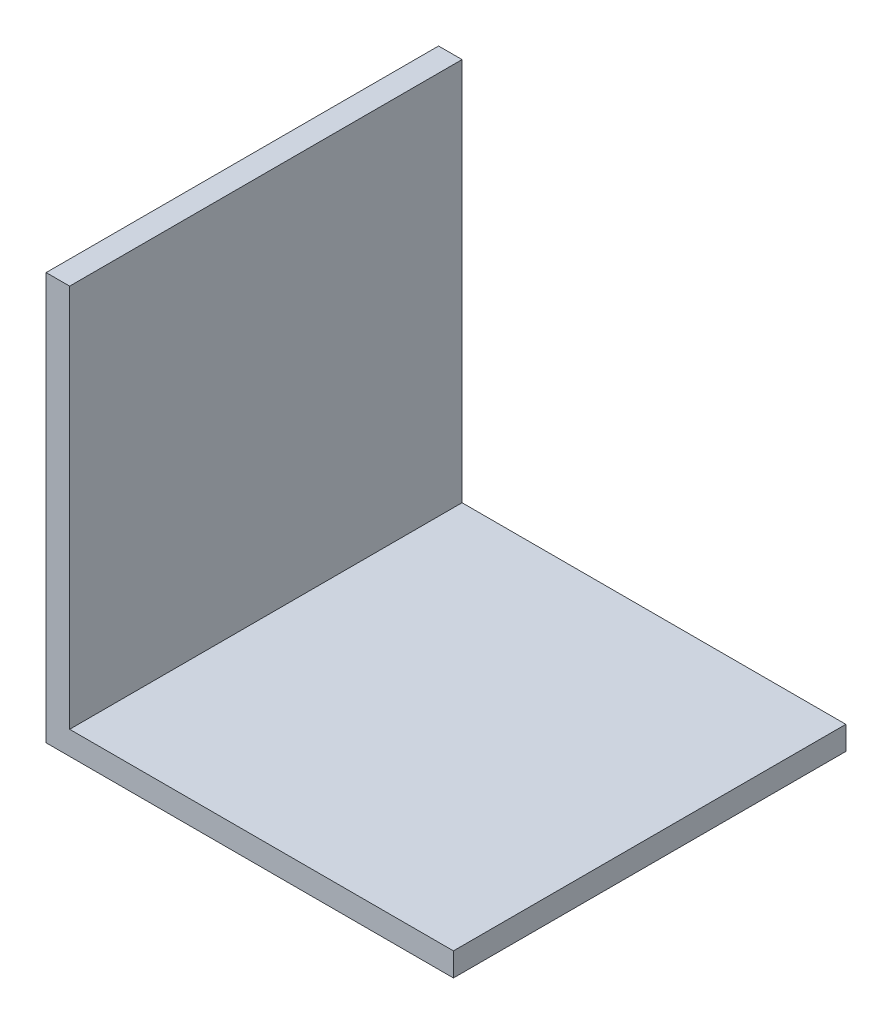
ISO-10303-21;
HEADER;
FILE_DESCRIPTION(('STEP AP214'),'2;1');
FILE_NAME('part.step','',(''),(''),'','','');
FILE_SCHEMA(('AUTOMOTIVE_DESIGN { 1 0 10303 214 1 1 1 1 }'));
ENDSEC;
DATA;
#1=APPLICATION_CONTEXT('core data for automotive mechanical design processes');
#2=APPLICATION_PROTOCOL_DEFINITION('international standard','automotive_design',2000,#1);
#3=PRODUCT_CONTEXT('',#1,'mechanical');
#4=PRODUCT('Part','Part','',(#3));
#5=PRODUCT_RELATED_PRODUCT_CATEGORY('part','',(#4));
#6=PRODUCT_DEFINITION_FORMATION('','',#4);
#7=PRODUCT_DEFINITION_CONTEXT('part definition',#1,'design');
#8=PRODUCT_DEFINITION('design','',#6,#7);
#9=PRODUCT_DEFINITION_SHAPE('','',#8);
#10=(LENGTH_UNIT() NAMED_UNIT(*) SI_UNIT(.MILLI.,.METRE.));
#11=(NAMED_UNIT(*) PLANE_ANGLE_UNIT() SI_UNIT($,.RADIAN.));
#12=(NAMED_UNIT(*) SI_UNIT($,.STERADIAN.) SOLID_ANGLE_UNIT());
#13=UNCERTAINTY_MEASURE_WITH_UNIT(LENGTH_MEASURE(1.E-05),#10,'distance_accuracy_value','');
#14=(GEOMETRIC_REPRESENTATION_CONTEXT(3) GLOBAL_UNCERTAINTY_ASSIGNED_CONTEXT((#13)) GLOBAL_UNIT_ASSIGNED_CONTEXT((#10,
#11,#12)) REPRESENTATION_CONTEXT('',''));
#15=CARTESIAN_POINT('',(0.,0.,0.));
#16=DIRECTION('',(0.,0.,1.));
#17=DIRECTION('',(1.,0.,0.));
#18=AXIS2_PLACEMENT_3D('',#15,#16,#17);
#19=CARTESIAN_POINT('',(0.,0.,25.05));
#20=DIRECTION('',(0.,1.,0.));
#21=DIRECTION('',(0.,0.,1.));
#22=AXIS2_PLACEMENT_3D('',#19,#20,#21);
#23=PLANE('',#22);
#24=DIRECTION('',(1.,0.,0.));
#25=VECTOR('',#24,1.);
#26=CARTESIAN_POINT('',(0.,0.,-25.05));
#27=LINE('',#26,#25);
#28=CARTESIAN_POINT('',(0.,0.,-25.05));
#29=VERTEX_POINT('',#28);
#30=CARTESIAN_POINT('',(52.,0.,-25.05));
#31=VERTEX_POINT('',#30);
#32=EDGE_CURVE('E125',#29,#31,#27,.T.);
#33=ORIENTED_EDGE('',*,*,#32,.T.);
#34=DIRECTION('',(0.,0.,-1.));
#35=VECTOR('',#34,1.);
#36=CARTESIAN_POINT('',(52.,0.,25.05));
#37=LINE('',#36,#35);
#38=CARTESIAN_POINT('',(52.,0.,25.05));
#39=VERTEX_POINT('',#38);
#40=EDGE_CURVE('E11',#39,#31,#37,.T.);
#41=ORIENTED_EDGE('',*,*,#40,.F.);
#42=DIRECTION('',(1.,0.,0.));
#43=VECTOR('',#42,1.);
#44=CARTESIAN_POINT('',(0.,0.,25.05));
#45=LINE('',#44,#43);
#46=CARTESIAN_POINT('',(0.,0.,25.05));
#47=VERTEX_POINT('',#46);
#48=EDGE_CURVE('E135',#47,#39,#45,.T.);
#49=ORIENTED_EDGE('',*,*,#48,.F.);
#50=DIRECTION('',(0.,0.,-1.));
#51=VECTOR('',#50,1.);
#52=CARTESIAN_POINT('',(0.,0.,25.05));
#53=LINE('',#52,#51);
#54=EDGE_CURVE('E121',#47,#29,#53,.T.);
#55=ORIENTED_EDGE('',*,*,#54,.T.);
#56=EDGE_LOOP('',(#33,#41,#49,#55));
#57=FACE_BOUND('',#56,.T.);
#58=ADVANCED_FACE('F41',(#57),#23,.F.);
#59=CARTESIAN_POINT('',(52.,3.,25.05));
#60=DIRECTION('',(-1.,0.,0.));
#61=DIRECTION('',(0.,0.,1.));
#62=AXIS2_PLACEMENT_3D('',#59,#60,#61);
#63=PLANE('',#62);
#64=DIRECTION('',(0.,1.,0.));
#65=VECTOR('',#64,1.);
#66=CARTESIAN_POINT('',(52.,3.,-25.05));
#67=LINE('',#66,#65);
#68=CARTESIAN_POINT('',(52.,3.,-25.05));
#69=VERTEX_POINT('',#68);
#70=EDGE_CURVE('E128',#31,#69,#67,.T.);
#71=ORIENTED_EDGE('',*,*,#70,.T.);
#72=DIRECTION('',(0.,0.,-1.));
#73=VECTOR('',#72,1.);
#74=CARTESIAN_POINT('',(52.,3.,25.05));
#75=LINE('',#74,#73);
#76=CARTESIAN_POINT('',(52.,3.,25.05));
#77=VERTEX_POINT('',#76);
#78=EDGE_CURVE('E49',#77,#69,#75,.T.);
#79=ORIENTED_EDGE('',*,*,#78,.F.);
#80=DIRECTION('',(0.,1.,0.));
#81=VECTOR('',#80,1.);
#82=CARTESIAN_POINT('',(52.,3.,25.05));
#83=LINE('',#82,#81);
#84=EDGE_CURVE('E94',#39,#77,#83,.T.);
#85=ORIENTED_EDGE('',*,*,#84,.F.);
#86=ORIENTED_EDGE('',*,*,#40,.T.);
#87=EDGE_LOOP('',(#71,#79,#85,#86));
#88=FACE_BOUND('',#87,.T.);
#89=ADVANCED_FACE('F159',(#88),#63,.F.);
#90=CARTESIAN_POINT('',(3.00000000000001,3.,25.05));
#91=DIRECTION('',(0.,-1.,0.));
#92=DIRECTION('',(0.,0.,-1.));
#93=AXIS2_PLACEMENT_3D('',#90,#91,#92);
#94=PLANE('',#93);
#95=DIRECTION('',(-1.,0.,0.));
#96=VECTOR('',#95,1.);
#97=CARTESIAN_POINT('',(3.00000000000001,3.,-25.05));
#98=LINE('',#97,#96);
#99=CARTESIAN_POINT('',(3.00000000000001,3.,-25.05));
#100=VERTEX_POINT('',#99);
#101=EDGE_CURVE('E130',#69,#100,#98,.T.);
#102=ORIENTED_EDGE('',*,*,#101,.T.);
#103=DIRECTION('',(0.,0.,-1.));
#104=VECTOR('',#103,1.);
#105=CARTESIAN_POINT('',(3.00000000000001,3.,25.05));
#106=LINE('',#105,#104);
#107=CARTESIAN_POINT('',(3.00000000000001,3.,25.05));
#108=VERTEX_POINT('',#107);
#109=EDGE_CURVE('E116',#108,#100,#106,.T.);
#110=ORIENTED_EDGE('',*,*,#109,.F.);
#111=DIRECTION('',(-1.,0.,0.));
#112=VECTOR('',#111,1.);
#113=CARTESIAN_POINT('',(3.00000000000001,3.,25.05));
#114=LINE('',#113,#112);
#115=EDGE_CURVE('E107',#77,#108,#114,.T.);
#116=ORIENTED_EDGE('',*,*,#115,.F.);
#117=ORIENTED_EDGE('',*,*,#78,.T.);
#118=EDGE_LOOP('',(#102,#110,#116,#117));
#119=FACE_BOUND('',#118,.T.);
#120=ADVANCED_FACE('F141',(#119),#94,.F.);
#121=CARTESIAN_POINT('',(3.,52.,25.05));
#122=DIRECTION('',(-1.,0.,0.));
#123=DIRECTION('',(0.,-1.,0.));
#124=AXIS2_PLACEMENT_3D('',#121,#122,#123);
#125=PLANE('',#124);
#126=DIRECTION('',(0.,1.,0.));
#127=VECTOR('',#126,1.);
#128=CARTESIAN_POINT('',(3.,52.,-25.05));
#129=LINE('',#128,#127);
#130=CARTESIAN_POINT('',(3.,52.,-25.05));
#131=VERTEX_POINT('',#130);
#132=EDGE_CURVE('E115',#100,#131,#129,.T.);
#133=ORIENTED_EDGE('',*,*,#132,.T.);
#134=DIRECTION('',(0.,0.,-1.));
#135=VECTOR('',#134,1.);
#136=CARTESIAN_POINT('',(3.,52.,25.05));
#137=LINE('',#136,#135);
#138=CARTESIAN_POINT('',(3.,52.,25.05));
#139=VERTEX_POINT('',#138);
#140=EDGE_CURVE('E112',#139,#131,#137,.T.);
#141=ORIENTED_EDGE('',*,*,#140,.F.);
#142=DIRECTION('',(0.,1.,0.));
#143=VECTOR('',#142,1.);
#144=CARTESIAN_POINT('',(3.,52.,25.05));
#145=LINE('',#144,#143);
#146=EDGE_CURVE('E101',#108,#139,#145,.T.);
#147=ORIENTED_EDGE('',*,*,#146,.F.);
#148=ORIENTED_EDGE('',*,*,#109,.T.);
#149=EDGE_LOOP('',(#133,#141,#147,#148));
#150=FACE_BOUND('',#149,.T.);
#151=ADVANCED_FACE('F113',(#150),#125,.F.);
#152=CARTESIAN_POINT('',(0.,52.,25.05));
#153=DIRECTION('',(0.,-1.,0.));
#154=DIRECTION('',(0.,0.,-1.));
#155=AXIS2_PLACEMENT_3D('',#152,#153,#154);
#156=PLANE('',#155);
#157=DIRECTION('',(-1.,0.,0.));
#158=VECTOR('',#157,1.);
#159=CARTESIAN_POINT('',(0.,52.,-25.05));
#160=LINE('',#159,#158);
#161=CARTESIAN_POINT('',(0.,52.,-25.05));
#162=VERTEX_POINT('',#161);
#163=EDGE_CURVE('E80',#131,#162,#160,.T.);
#164=ORIENTED_EDGE('',*,*,#163,.T.);
#165=DIRECTION('',(0.,0.,-1.));
#166=VECTOR('',#165,1.);
#167=CARTESIAN_POINT('',(0.,52.,25.05));
#168=LINE('',#167,#166);
#169=CARTESIAN_POINT('',(0.,52.,25.05));
#170=VERTEX_POINT('',#169);
#171=EDGE_CURVE('E117',#170,#162,#168,.T.);
#172=ORIENTED_EDGE('',*,*,#171,.F.);
#173=DIRECTION('',(-1.,0.,0.));
#174=VECTOR('',#173,1.);
#175=CARTESIAN_POINT('',(0.,52.,25.05));
#176=LINE('',#175,#174);
#177=EDGE_CURVE('E105',#139,#170,#176,.T.);
#178=ORIENTED_EDGE('',*,*,#177,.F.);
#179=ORIENTED_EDGE('',*,*,#140,.T.);
#180=EDGE_LOOP('',(#164,#172,#178,#179));
#181=FACE_BOUND('',#180,.T.);
#182=ADVANCED_FACE('F119',(#181),#156,.F.);
#183=CARTESIAN_POINT('',(0.,0.,25.05));
#184=DIRECTION('',(1.,0.,0.));
#185=DIRECTION('',(0.,0.,-1.));
#186=AXIS2_PLACEMENT_3D('',#183,#184,#185);
#187=PLANE('',#186);
#188=DIRECTION('',(0.,-1.,0.));
#189=VECTOR('',#188,1.);
#190=CARTESIAN_POINT('',(0.,0.,-25.05));
#191=LINE('',#190,#189);
#192=EDGE_CURVE('E86',#162,#29,#191,.T.);
#193=ORIENTED_EDGE('',*,*,#192,.T.);
#194=ORIENTED_EDGE('',*,*,#54,.F.);
#195=DIRECTION('',(0.,-1.,0.));
#196=VECTOR('',#195,1.);
#197=CARTESIAN_POINT('',(0.,0.,25.05));
#198=LINE('',#197,#196);
#199=EDGE_CURVE('E57',#170,#47,#198,.T.);
#200=ORIENTED_EDGE('',*,*,#199,.F.);
#201=ORIENTED_EDGE('',*,*,#171,.T.);
#202=EDGE_LOOP('',(#193,#194,#200,#201));
#203=FACE_BOUND('',#202,.T.);
#204=ADVANCED_FACE('F148',(#203),#187,.F.);
#205=CARTESIAN_POINT('',(0.,0.,25.05));
#206=DIRECTION('',(0.,0.,-1.));
#207=DIRECTION('',(-1.,0.,0.));
#208=AXIS2_PLACEMENT_3D('',#205,#206,#207);
#209=PLANE('',#208);
#210=ORIENTED_EDGE('',*,*,#48,.T.);
#211=ORIENTED_EDGE('',*,*,#84,.T.);
#212=ORIENTED_EDGE('',*,*,#115,.T.);
#213=ORIENTED_EDGE('',*,*,#146,.T.);
#214=ORIENTED_EDGE('',*,*,#177,.T.);
#215=ORIENTED_EDGE('',*,*,#199,.T.);
#216=EDGE_LOOP('',(#210,#211,#212,#213,#214,#215));
#217=FACE_BOUND('',#216,.T.);
#218=ADVANCED_FACE('F103',(#217),#209,.F.);
#219=CARTESIAN_POINT('',(0.,0.,-25.05));
#220=DIRECTION('',(0.,0.,-1.));
#221=DIRECTION('',(-1.,0.,0.));
#222=AXIS2_PLACEMENT_3D('',#219,#220,#221);
#223=PLANE('',#222);
#224=ORIENTED_EDGE('',*,*,#32,.F.);
#225=ORIENTED_EDGE('',*,*,#192,.F.);
#226=ORIENTED_EDGE('',*,*,#163,.F.);
#227=ORIENTED_EDGE('',*,*,#132,.F.);
#228=ORIENTED_EDGE('',*,*,#101,.F.);
#229=ORIENTED_EDGE('',*,*,#70,.F.);
#230=EDGE_LOOP('',(#224,#225,#226,#227,#228,#229));
#231=FACE_BOUND('',#230,.T.);
#232=ADVANCED_FACE('F144',(#231),#223,.T.);
#233=CLOSED_SHELL('',(#58,#89,#120,#151,#182,#204,#218,#232));
#234=MANIFOLD_SOLID_BREP('B2',#233);
#235=ADVANCED_BREP_SHAPE_REPRESENTATION('',(#18,#234),#14);
#236=SHAPE_DEFINITION_REPRESENTATION(#9,#235);
ENDSEC;
END-ISO-10303-21;
